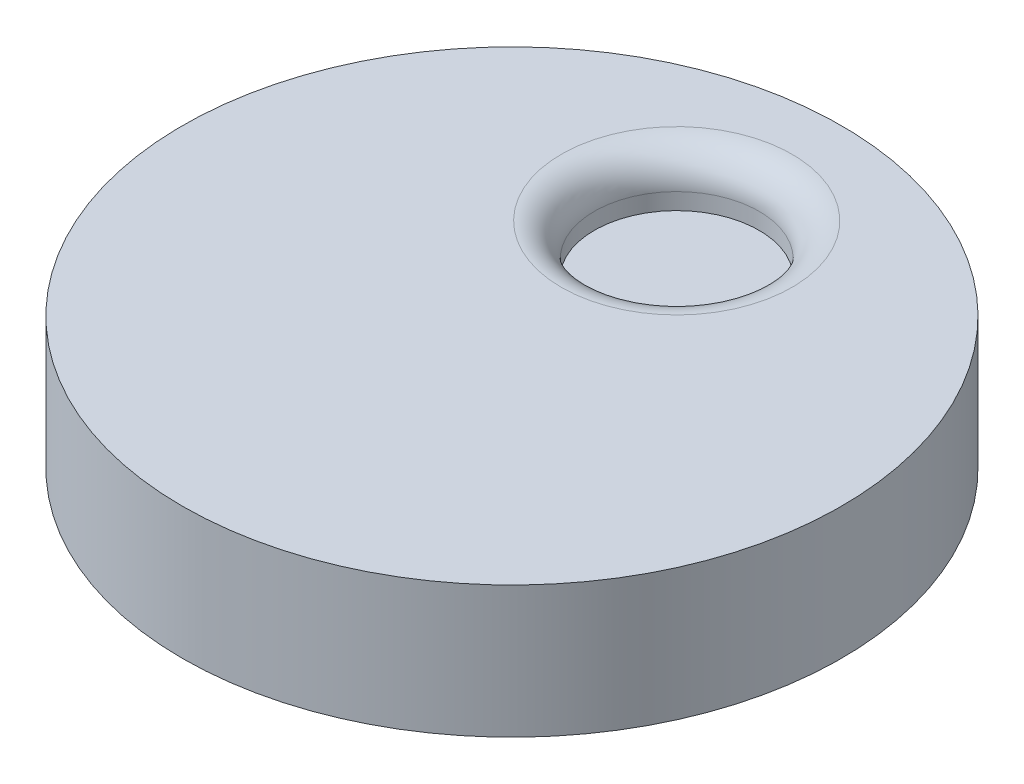
ISO-10303-21;
HEADER;
FILE_DESCRIPTION(('STEP AP214'),'2;1');
FILE_NAME('part.step','',(''),(''),'','','');
FILE_SCHEMA(('AUTOMOTIVE_DESIGN { 1 0 10303 214 1 1 1 1 }'));
ENDSEC;
DATA;
#1=APPLICATION_CONTEXT('core data for automotive mechanical design processes');
#2=APPLICATION_PROTOCOL_DEFINITION('international standard','automotive_design',2000,#1);
#3=PRODUCT_CONTEXT('',#1,'mechanical');
#4=PRODUCT('Part','Part','',(#3));
#5=PRODUCT_RELATED_PRODUCT_CATEGORY('part','',(#4));
#6=PRODUCT_DEFINITION_FORMATION('','',#4);
#7=PRODUCT_DEFINITION_CONTEXT('part definition',#1,'design');
#8=PRODUCT_DEFINITION('design','',#6,#7);
#9=PRODUCT_DEFINITION_SHAPE('','',#8);
#10=(LENGTH_UNIT() NAMED_UNIT(*) SI_UNIT(.MILLI.,.METRE.));
#11=(NAMED_UNIT(*) PLANE_ANGLE_UNIT() SI_UNIT($,.RADIAN.));
#12=(NAMED_UNIT(*) SI_UNIT($,.STERADIAN.) SOLID_ANGLE_UNIT());
#13=UNCERTAINTY_MEASURE_WITH_UNIT(LENGTH_MEASURE(1.E-05),#10,'distance_accuracy_value','');
#14=(GEOMETRIC_REPRESENTATION_CONTEXT(3) GLOBAL_UNCERTAINTY_ASSIGNED_CONTEXT((#13)) GLOBAL_UNIT_ASSIGNED_CONTEXT((#10,
#11,#12)) REPRESENTATION_CONTEXT('',''));
#15=CARTESIAN_POINT('',(0.,0.,0.));
#16=DIRECTION('',(0.,0.,1.));
#17=DIRECTION('',(1.,0.,0.));
#18=AXIS2_PLACEMENT_3D('',#15,#16,#17);
#19=CARTESIAN_POINT('',(0.,8.,0.));
#20=DIRECTION('',(0.,-1.,0.));
#21=DIRECTION('',(0.,0.,-1.));
#22=AXIS2_PLACEMENT_3D('',#19,#20,#21);
#23=CYLINDRICAL_SURFACE('',#22,20.);
#24=CARTESIAN_POINT('',(0.,8.,0.));
#25=DIRECTION('',(0.,1.,0.));
#26=DIRECTION('',(0.,0.,1.));
#27=AXIS2_PLACEMENT_3D('',#24,#25,#26);
#28=CIRCLE('',#27,20.);
#29=CARTESIAN_POINT('',(0.,8.,20.));
#30=VERTEX_POINT('',#29);
#31=EDGE_CURVE('E42',#30,#30,#28,.T.);
#32=ORIENTED_EDGE('',*,*,#31,.F.);
#33=EDGE_LOOP('',(#32));
#34=FACE_BOUND('',#33,.T.);
#35=CARTESIAN_POINT('',(0.,0.,0.));
#36=DIRECTION('',(0.,1.,0.));
#37=DIRECTION('',(0.,0.,1.));
#38=AXIS2_PLACEMENT_3D('',#35,#36,#37);
#39=CIRCLE('',#38,20.);
#40=CARTESIAN_POINT('',(0.,0.,20.));
#41=VERTEX_POINT('',#40);
#42=EDGE_CURVE('E46',#41,#41,#39,.T.);
#43=ORIENTED_EDGE('',*,*,#42,.T.);
#44=EDGE_LOOP('',(#43));
#45=FACE_BOUND('',#44,.T.);
#46=ADVANCED_FACE('F31',(#34,#45),#23,.T.);
#47=CARTESIAN_POINT('',(0.,8.,0.));
#48=DIRECTION('',(0.,1.,0.));
#49=DIRECTION('',(0.,0.,1.));
#50=AXIS2_PLACEMENT_3D('',#47,#48,#49);
#51=PLANE('',#50);
#52=CARTESIAN_POINT('',(0.,8.,-10.));
#53=DIRECTION('',(0.,1.,0.));
#54=DIRECTION('',(0.,0.,1.));
#55=AXIS2_PLACEMENT_3D('',#52,#53,#54);
#56=CIRCLE('',#55,7.);
#57=CARTESIAN_POINT('',(0.,8.,-3.));
#58=VERTEX_POINT('',#57);
#59=EDGE_CURVE('E10',#58,#58,#56,.F.);
#60=ORIENTED_EDGE('',*,*,#59,.T.);
#61=EDGE_LOOP('',(#60));
#62=FACE_BOUND('',#61,.T.);
#63=ORIENTED_EDGE('',*,*,#31,.T.);
#64=EDGE_LOOP('',(#63));
#65=FACE_BOUND('',#64,.T.);
#66=ADVANCED_FACE('F66',(#62,#65),#51,.T.);
#67=CARTESIAN_POINT('',(0.,0.,0.));
#68=DIRECTION('',(0.,1.,0.));
#69=DIRECTION('',(0.,0.,1.));
#70=AXIS2_PLACEMENT_3D('',#67,#68,#69);
#71=PLANE('',#70);
#72=ORIENTED_EDGE('',*,*,#42,.F.);
#73=EDGE_LOOP('',(#72));
#74=FACE_BOUND('',#73,.T.);
#75=ADVANCED_FACE('F59',(#74),#71,.F.);
#76=CARTESIAN_POINT('',(0.,5.,-10.));
#77=DIRECTION('',(0.,1.,0.));
#78=DIRECTION('',(0.,0.,1.));
#79=AXIS2_PLACEMENT_3D('',#76,#77,#78);
#80=CYLINDRICAL_SURFACE('',#79,5.);
#81=CARTESIAN_POINT('',(0.,6.,-10.));
#82=DIRECTION('',(0.,1.,0.));
#83=DIRECTION('',(0.,0.,1.));
#84=AXIS2_PLACEMENT_3D('',#81,#82,#83);
#85=CIRCLE('',#84,5.);
#86=CARTESIAN_POINT('',(0.,6.,-5.));
#87=VERTEX_POINT('',#86);
#88=EDGE_CURVE('E38',#87,#87,#85,.T.);
#89=ORIENTED_EDGE('',*,*,#88,.T.);
#90=EDGE_LOOP('',(#89));
#91=FACE_BOUND('',#90,.T.);
#92=CARTESIAN_POINT('',(0.,5.,-10.));
#93=DIRECTION('',(0.,1.,0.));
#94=DIRECTION('',(0.,0.,1.));
#95=AXIS2_PLACEMENT_3D('',#92,#93,#94);
#96=CIRCLE('',#95,5.);
#97=CARTESIAN_POINT('',(0.,5.,-5.));
#98=VERTEX_POINT('',#97);
#99=EDGE_CURVE('E50',#98,#98,#96,.T.);
#100=ORIENTED_EDGE('',*,*,#99,.F.);
#101=EDGE_LOOP('',(#100));
#102=FACE_BOUND('',#101,.T.);
#103=ADVANCED_FACE('F57',(#91,#102),#80,.F.);
#104=CARTESIAN_POINT('',(0.,5.,-10.));
#105=DIRECTION('',(0.,1.,0.));
#106=DIRECTION('',(0.,0.,1.));
#107=AXIS2_PLACEMENT_3D('',#104,#105,#106);
#108=PLANE('',#107);
#109=ORIENTED_EDGE('',*,*,#99,.T.);
#110=EDGE_LOOP('',(#109));
#111=FACE_BOUND('',#110,.T.);
#112=ADVANCED_FACE('F55',(#111),#108,.T.);
#113=CARTESIAN_POINT('',(0.,6.,-10.));
#114=DIRECTION('',(0.,1.,0.));
#115=DIRECTION('',(0.,0.,1.));
#116=AXIS2_PLACEMENT_3D('',#113,#114,#115);
#117=TOROIDAL_SURFACE('',#116,7.,2.);
#118=ORIENTED_EDGE('',*,*,#59,.F.);
#119=EDGE_LOOP('',(#118));
#120=FACE_BOUND('',#119,.T.);
#121=ORIENTED_EDGE('',*,*,#88,.F.);
#122=EDGE_LOOP('',(#121));
#123=FACE_BOUND('',#122,.T.);
#124=ADVANCED_FACE('F33',(#120,#123),#117,.T.);
#125=CLOSED_SHELL('',(#46,#66,#75,#103,#112,#124));
#126=MANIFOLD_SOLID_BREP('B2',#125);
#127=ADVANCED_BREP_SHAPE_REPRESENTATION('',(#18,#126),#14);
#128=SHAPE_DEFINITION_REPRESENTATION(#9,#127);
ENDSEC;
END-ISO-10303-21;
